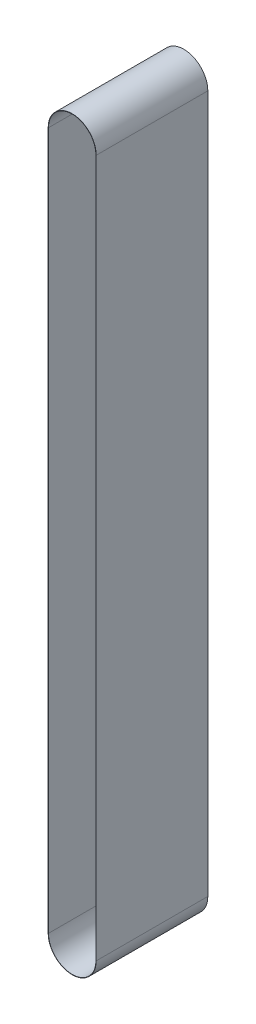
ISO-10303-21;
HEADER;
FILE_DESCRIPTION(('STEP AP214'),'2;1');
FILE_NAME('part.step','',(''),(''),'','','');
FILE_SCHEMA(('AUTOMOTIVE_DESIGN { 1 0 10303 214 1 1 1 1 }'));
ENDSEC;
DATA;
#1=APPLICATION_CONTEXT('core data for automotive mechanical design processes');
#2=APPLICATION_PROTOCOL_DEFINITION('international standard','automotive_design',2000,#1);
#3=PRODUCT_CONTEXT('',#1,'mechanical');
#4=PRODUCT('Part','Part','',(#3));
#5=PRODUCT_RELATED_PRODUCT_CATEGORY('part','',(#4));
#6=PRODUCT_DEFINITION_FORMATION('','',#4);
#7=PRODUCT_DEFINITION_CONTEXT('part definition',#1,'design');
#8=PRODUCT_DEFINITION('design','',#6,#7);
#9=PRODUCT_DEFINITION_SHAPE('','',#8);
#10=(LENGTH_UNIT() NAMED_UNIT(*) SI_UNIT(.MILLI.,.METRE.));
#11=(NAMED_UNIT(*) PLANE_ANGLE_UNIT() SI_UNIT($,.RADIAN.));
#12=(NAMED_UNIT(*) SI_UNIT($,.STERADIAN.) SOLID_ANGLE_UNIT());
#13=UNCERTAINTY_MEASURE_WITH_UNIT(LENGTH_MEASURE(1.E-05),#10,'distance_accuracy_value','');
#14=(GEOMETRIC_REPRESENTATION_CONTEXT(3) GLOBAL_UNCERTAINTY_ASSIGNED_CONTEXT((#13)) GLOBAL_UNIT_ASSIGNED_CONTEXT((#10,
#11,#12)) REPRESENTATION_CONTEXT('',''));
#15=CARTESIAN_POINT('',(0.,0.,0.));
#16=DIRECTION('',(0.,0.,1.));
#17=DIRECTION('',(1.,0.,0.));
#18=AXIS2_PLACEMENT_3D('',#15,#16,#17);
#19=CARTESIAN_POINT('',(0.,-250.,40.));
#20=DIRECTION('',(0.,0.,1.));
#21=DIRECTION('',(1.,0.,0.));
#22=AXIS2_PLACEMENT_3D('',#19,#20,#21);
#23=PLANE('',#22);
#24=CARTESIAN_POINT('',(0.,-250.,40.));
#25=DIRECTION('',(0.,0.,1.));
#26=DIRECTION('',(1.,0.,0.));
#27=AXIS2_PLACEMENT_3D('',#24,#25,#26);
#28=CIRCLE('',#27,17.2);
#29=CARTESIAN_POINT('',(-17.2,-250.,40.));
#30=VERTEX_POINT('',#29);
#31=CARTESIAN_POINT('',(17.2,-250.,40.));
#32=VERTEX_POINT('',#31);
#33=EDGE_CURVE('E175',#30,#32,#28,.T.);
#34=ORIENTED_EDGE('',*,*,#33,.T.);
#35=DIRECTION('',(0.,1.,0.));
#36=VECTOR('',#35,1.);
#37=CARTESIAN_POINT('',(17.2,250.,40.));
#38=LINE('',#37,#36);
#39=CARTESIAN_POINT('',(17.2,250.,40.));
#40=VERTEX_POINT('',#39);
#41=EDGE_CURVE('E178',#32,#40,#38,.T.);
#42=ORIENTED_EDGE('',*,*,#41,.T.);
#43=CARTESIAN_POINT('',(0.,250.,40.));
#44=DIRECTION('',(0.,0.,1.));
#45=DIRECTION('',(-1.,0.,0.));
#46=AXIS2_PLACEMENT_3D('',#43,#44,#45);
#47=CIRCLE('',#46,17.2);
#48=CARTESIAN_POINT('',(-17.2,250.,40.));
#49=VERTEX_POINT('',#48);
#50=EDGE_CURVE('E181',#40,#49,#47,.T.);
#51=ORIENTED_EDGE('',*,*,#50,.T.);
#52=DIRECTION('',(0.,-1.,0.));
#53=VECTOR('',#52,1.);
#54=CARTESIAN_POINT('',(-17.2,-250.,40.));
#55=LINE('',#54,#53);
#56=EDGE_CURVE('E183',#49,#30,#55,.T.);
#57=ORIENTED_EDGE('',*,*,#56,.T.);
#58=EDGE_LOOP('',(#34,#42,#51,#57));
#59=FACE_BOUND('',#58,.T.);
#60=DIRECTION('',(0.,-1.,0.));
#61=VECTOR('',#60,1.);
#62=CARTESIAN_POINT('',(-17.,-250.,40.));
#63=LINE('',#62,#61);
#64=CARTESIAN_POINT('',(-17.,250.,40.));
#65=VERTEX_POINT('',#64);
#66=CARTESIAN_POINT('',(-17.,-250.,40.));
#67=VERTEX_POINT('',#66);
#68=EDGE_CURVE('E146',#65,#67,#63,.T.);
#69=ORIENTED_EDGE('',*,*,#68,.F.);
#70=CARTESIAN_POINT('',(0.,250.,40.));
#71=DIRECTION('',(0.,0.,1.));
#72=DIRECTION('',(-1.,0.,0.));
#73=AXIS2_PLACEMENT_3D('',#70,#71,#72);
#74=CIRCLE('',#73,17.);
#75=CARTESIAN_POINT('',(17.,250.,40.));
#76=VERTEX_POINT('',#75);
#77=EDGE_CURVE('E144',#76,#65,#74,.T.);
#78=ORIENTED_EDGE('',*,*,#77,.F.);
#79=DIRECTION('',(0.,1.,0.));
#80=VECTOR('',#79,1.);
#81=CARTESIAN_POINT('',(17.,250.,40.));
#82=LINE('',#81,#80);
#83=CARTESIAN_POINT('',(17.,-250.,40.));
#84=VERTEX_POINT('',#83);
#85=EDGE_CURVE('E152',#84,#76,#82,.T.);
#86=ORIENTED_EDGE('',*,*,#85,.F.);
#87=CARTESIAN_POINT('',(0.,-250.,40.));
#88=DIRECTION('',(0.,0.,1.));
#89=DIRECTION('',(1.,0.,0.));
#90=AXIS2_PLACEMENT_3D('',#87,#88,#89);
#91=CIRCLE('',#90,17.);
#92=EDGE_CURVE('E149',#67,#84,#91,.T.);
#93=ORIENTED_EDGE('',*,*,#92,.F.);
#94=EDGE_LOOP('',(#69,#78,#86,#93));
#95=FACE_BOUND('',#94,.T.);
#96=ADVANCED_FACE('F33',(#59,#95),#23,.T.);
#97=CARTESIAN_POINT('',(0.,-250.,-40.));
#98=DIRECTION('',(0.,0.,1.));
#99=DIRECTION('',(1.,0.,0.));
#100=AXIS2_PLACEMENT_3D('',#97,#98,#99);
#101=PLANE('',#100);
#102=CARTESIAN_POINT('',(0.,-250.,-40.));
#103=DIRECTION('',(0.,0.,1.));
#104=DIRECTION('',(1.,0.,0.));
#105=AXIS2_PLACEMENT_3D('',#102,#103,#104);
#106=CIRCLE('',#105,17.2);
#107=CARTESIAN_POINT('',(-17.2,-250.,-40.));
#108=VERTEX_POINT('',#107);
#109=CARTESIAN_POINT('',(17.2,-250.,-40.));
#110=VERTEX_POINT('',#109);
#111=EDGE_CURVE('E174',#108,#110,#106,.T.);
#112=ORIENTED_EDGE('',*,*,#111,.F.);
#113=DIRECTION('',(0.,-1.,0.));
#114=VECTOR('',#113,1.);
#115=CARTESIAN_POINT('',(-17.2,-250.,-40.));
#116=LINE('',#115,#114);
#117=CARTESIAN_POINT('',(-17.2,250.,-40.));
#118=VERTEX_POINT('',#117);
#119=EDGE_CURVE('E179',#118,#108,#116,.T.);
#120=ORIENTED_EDGE('',*,*,#119,.F.);
#121=CARTESIAN_POINT('',(0.,250.,-40.));
#122=DIRECTION('',(0.,0.,1.));
#123=DIRECTION('',(-1.,0.,0.));
#124=AXIS2_PLACEMENT_3D('',#121,#122,#123);
#125=CIRCLE('',#124,17.2);
#126=CARTESIAN_POINT('',(17.2,250.,-40.));
#127=VERTEX_POINT('',#126);
#128=EDGE_CURVE('E190',#127,#118,#125,.T.);
#129=ORIENTED_EDGE('',*,*,#128,.F.);
#130=DIRECTION('',(0.,1.,0.));
#131=VECTOR('',#130,1.);
#132=CARTESIAN_POINT('',(17.2,250.,-40.));
#133=LINE('',#132,#131);
#134=EDGE_CURVE('E188',#110,#127,#133,.T.);
#135=ORIENTED_EDGE('',*,*,#134,.F.);
#136=EDGE_LOOP('',(#112,#120,#129,#135));
#137=FACE_BOUND('',#136,.T.);
#138=CARTESIAN_POINT('',(0.,250.,-40.));
#139=DIRECTION('',(0.,0.,1.));
#140=DIRECTION('',(-1.,0.,0.));
#141=AXIS2_PLACEMENT_3D('',#138,#139,#140);
#142=CIRCLE('',#141,17.);
#143=CARTESIAN_POINT('',(17.,250.,-40.));
#144=VERTEX_POINT('',#143);
#145=CARTESIAN_POINT('',(-17.,250.,-40.));
#146=VERTEX_POINT('',#145);
#147=EDGE_CURVE('E140',#144,#146,#142,.T.);
#148=ORIENTED_EDGE('',*,*,#147,.T.);
#149=DIRECTION('',(0.,-1.,0.));
#150=VECTOR('',#149,1.);
#151=CARTESIAN_POINT('',(-17.,-250.,-40.));
#152=LINE('',#151,#150);
#153=CARTESIAN_POINT('',(-17.,-250.,-40.));
#154=VERTEX_POINT('',#153);
#155=EDGE_CURVE('E157',#146,#154,#152,.T.);
#156=ORIENTED_EDGE('',*,*,#155,.T.);
#157=CARTESIAN_POINT('',(0.,-250.,-40.));
#158=DIRECTION('',(0.,0.,1.));
#159=DIRECTION('',(1.,0.,0.));
#160=AXIS2_PLACEMENT_3D('',#157,#158,#159);
#161=CIRCLE('',#160,17.);
#162=CARTESIAN_POINT('',(17.,-250.,-40.));
#163=VERTEX_POINT('',#162);
#164=EDGE_CURVE('E160',#154,#163,#161,.T.);
#165=ORIENTED_EDGE('',*,*,#164,.T.);
#166=DIRECTION('',(0.,1.,0.));
#167=VECTOR('',#166,1.);
#168=CARTESIAN_POINT('',(17.,250.,-40.));
#169=LINE('',#168,#167);
#170=EDGE_CURVE('E147',#163,#144,#169,.T.);
#171=ORIENTED_EDGE('',*,*,#170,.T.);
#172=EDGE_LOOP('',(#148,#156,#165,#171));
#173=FACE_BOUND('',#172,.T.);
#174=ADVANCED_FACE('F229',(#137,#173),#101,.F.);
#175=CARTESIAN_POINT('',(0.,-250.,40.));
#176=DIRECTION('',(0.,0.,-1.));
#177=DIRECTION('',(-1.,0.,0.));
#178=AXIS2_PLACEMENT_3D('',#175,#176,#177);
#179=CYLINDRICAL_SURFACE('',#178,17.2);
#180=DIRECTION('',(0.,0.,-1.));
#181=VECTOR('',#180,1.);
#182=CARTESIAN_POINT('',(5.,-266.457217261737,40.));
#183=LINE('',#182,#181);
#184=CARTESIAN_POINT('',(5.,-266.457217261737,-5.));
#185=VERTEX_POINT('',#184);
#186=CARTESIAN_POINT('',(5.,-266.457217261737,5.));
#187=VERTEX_POINT('',#186);
#188=EDGE_CURVE('E138',#185,#187,#183,.F.);
#189=ORIENTED_EDGE('',*,*,#188,.F.);
#190=CARTESIAN_POINT('',(0.,-250.,-5.));
#191=DIRECTION('',(0.,0.,-1.));
#192=DIRECTION('',(-1.,0.,0.));
#193=AXIS2_PLACEMENT_3D('',#190,#191,#192);
#194=CIRCLE('',#193,17.2);
#195=CARTESIAN_POINT('',(-5.,-266.457217261737,-5.));
#196=VERTEX_POINT('',#195);
#197=EDGE_CURVE('E123',#185,#196,#194,.T.);
#198=ORIENTED_EDGE('',*,*,#197,.T.);
#199=DIRECTION('',(0.,0.,-1.));
#200=VECTOR('',#199,1.);
#201=CARTESIAN_POINT('',(-5.,-266.457217261737,40.));
#202=LINE('',#201,#200);
#203=CARTESIAN_POINT('',(-5.,-266.457217261737,5.));
#204=VERTEX_POINT('',#203);
#205=EDGE_CURVE('E129',#196,#204,#202,.F.);
#206=ORIENTED_EDGE('',*,*,#205,.T.);
#207=CARTESIAN_POINT('',(0.,-250.,5.));
#208=DIRECTION('',(0.,0.,-1.));
#209=DIRECTION('',(-1.,0.,0.));
#210=AXIS2_PLACEMENT_3D('',#207,#208,#209);
#211=CIRCLE('',#210,17.2);
#212=EDGE_CURVE('E118',#187,#204,#211,.T.);
#213=ORIENTED_EDGE('',*,*,#212,.F.);
#214=EDGE_LOOP('',(#189,#198,#206,#213));
#215=FACE_BOUND('',#214,.T.);
#216=ORIENTED_EDGE('',*,*,#111,.T.);
#217=DIRECTION('',(0.,0.,-1.));
#218=VECTOR('',#217,1.);
#219=CARTESIAN_POINT('',(17.2,-250.,40.));
#220=LINE('',#219,#218);
#221=EDGE_CURVE('E201',#32,#110,#220,.T.);
#222=ORIENTED_EDGE('',*,*,#221,.F.);
#223=ORIENTED_EDGE('',*,*,#33,.F.);
#224=DIRECTION('',(0.,0.,-1.));
#225=VECTOR('',#224,1.);
#226=CARTESIAN_POINT('',(-17.2,-250.,40.));
#227=LINE('',#226,#225);
#228=EDGE_CURVE('E185',#30,#108,#227,.T.);
#229=ORIENTED_EDGE('',*,*,#228,.T.);
#230=EDGE_LOOP('',(#216,#222,#223,#229));
#231=FACE_BOUND('',#230,.T.);
#232=ADVANCED_FACE('F35',(#215,#231),#179,.T.);
#233=CARTESIAN_POINT('',(17.2,250.,40.));
#234=DIRECTION('',(-1.,0.,0.));
#235=DIRECTION('',(0.,0.,1.));
#236=AXIS2_PLACEMENT_3D('',#233,#234,#235);
#237=PLANE('',#236);
#238=ORIENTED_EDGE('',*,*,#134,.T.);
#239=DIRECTION('',(0.,0.,-1.));
#240=VECTOR('',#239,1.);
#241=CARTESIAN_POINT('',(17.2,250.,40.));
#242=LINE('',#241,#240);
#243=EDGE_CURVE('E198',#40,#127,#242,.T.);
#244=ORIENTED_EDGE('',*,*,#243,.F.);
#245=ORIENTED_EDGE('',*,*,#41,.F.);
#246=ORIENTED_EDGE('',*,*,#221,.T.);
#247=EDGE_LOOP('',(#238,#244,#245,#246));
#248=FACE_BOUND('',#247,.T.);
#249=ADVANCED_FACE('F248',(#248),#237,.F.);
#250=CARTESIAN_POINT('',(0.,250.,40.));
#251=DIRECTION('',(0.,0.,-1.));
#252=DIRECTION('',(-1.,0.,0.));
#253=AXIS2_PLACEMENT_3D('',#250,#251,#252);
#254=CYLINDRICAL_SURFACE('',#253,17.2);
#255=ORIENTED_EDGE('',*,*,#128,.T.);
#256=DIRECTION('',(0.,0.,-1.));
#257=VECTOR('',#256,1.);
#258=CARTESIAN_POINT('',(-17.2,250.,40.));
#259=LINE('',#258,#257);
#260=EDGE_CURVE('E195',#49,#118,#259,.T.);
#261=ORIENTED_EDGE('',*,*,#260,.F.);
#262=ORIENTED_EDGE('',*,*,#50,.F.);
#263=ORIENTED_EDGE('',*,*,#243,.T.);
#264=EDGE_LOOP('',(#255,#261,#262,#263));
#265=FACE_BOUND('',#264,.T.);
#266=ADVANCED_FACE('F245',(#265),#254,.T.);
#267=CARTESIAN_POINT('',(-17.2,-250.,40.));
#268=DIRECTION('',(1.,0.,0.));
#269=DIRECTION('',(0.,0.,-1.));
#270=AXIS2_PLACEMENT_3D('',#267,#268,#269);
#271=PLANE('',#270);
#272=ORIENTED_EDGE('',*,*,#119,.T.);
#273=ORIENTED_EDGE('',*,*,#228,.F.);
#274=ORIENTED_EDGE('',*,*,#56,.F.);
#275=ORIENTED_EDGE('',*,*,#260,.T.);
#276=EDGE_LOOP('',(#272,#273,#274,#275));
#277=FACE_BOUND('',#276,.T.);
#278=ADVANCED_FACE('F242',(#277),#271,.F.);
#279=CARTESIAN_POINT('',(0.,250.,40.));
#280=DIRECTION('',(0.,0.,-1.));
#281=DIRECTION('',(-1.,0.,0.));
#282=AXIS2_PLACEMENT_3D('',#279,#280,#281);
#283=CYLINDRICAL_SURFACE('',#282,17.);
#284=ORIENTED_EDGE('',*,*,#147,.F.);
#285=DIRECTION('',(0.,0.,-1.));
#286=VECTOR('',#285,1.);
#287=CARTESIAN_POINT('',(17.,250.,40.));
#288=LINE('',#287,#286);
#289=EDGE_CURVE('E154',#76,#144,#288,.T.);
#290=ORIENTED_EDGE('',*,*,#289,.F.);
#291=ORIENTED_EDGE('',*,*,#77,.T.);
#292=DIRECTION('',(0.,0.,-1.));
#293=VECTOR('',#292,1.);
#294=CARTESIAN_POINT('',(-17.,250.,40.));
#295=LINE('',#294,#293);
#296=EDGE_CURVE('E171',#65,#146,#295,.T.);
#297=ORIENTED_EDGE('',*,*,#296,.T.);
#298=EDGE_LOOP('',(#284,#290,#291,#297));
#299=FACE_BOUND('',#298,.T.);
#300=ADVANCED_FACE('F239',(#299),#283,.F.);
#301=CARTESIAN_POINT('',(-17.,-250.,40.));
#302=DIRECTION('',(1.,0.,0.));
#303=DIRECTION('',(0.,0.,-1.));
#304=AXIS2_PLACEMENT_3D('',#301,#302,#303);
#305=PLANE('',#304);
#306=ORIENTED_EDGE('',*,*,#155,.F.);
#307=ORIENTED_EDGE('',*,*,#296,.F.);
#308=ORIENTED_EDGE('',*,*,#68,.T.);
#309=DIRECTION('',(0.,0.,-1.));
#310=VECTOR('',#309,1.);
#311=CARTESIAN_POINT('',(-17.,-250.,40.));
#312=LINE('',#311,#310);
#313=EDGE_CURVE('E169',#67,#154,#312,.T.);
#314=ORIENTED_EDGE('',*,*,#313,.T.);
#315=EDGE_LOOP('',(#306,#307,#308,#314));
#316=FACE_BOUND('',#315,.T.);
#317=ADVANCED_FACE('F277',(#316),#305,.T.);
#318=CARTESIAN_POINT('',(0.,-250.,40.));
#319=DIRECTION('',(0.,0.,-1.));
#320=DIRECTION('',(-1.,0.,0.));
#321=AXIS2_PLACEMENT_3D('',#318,#319,#320);
#322=CYLINDRICAL_SURFACE('',#321,17.);
#323=CARTESIAN_POINT('',(0.,-250.,-5.));
#324=DIRECTION('',(0.,0.,-1.));
#325=DIRECTION('',(-1.,0.,0.));
#326=AXIS2_PLACEMENT_3D('',#323,#324,#325);
#327=CIRCLE('',#326,17.);
#328=CARTESIAN_POINT('',(5.,-266.248076809272,-5.));
#329=VERTEX_POINT('',#328);
#330=CARTESIAN_POINT('',(-5.,-266.248076809272,-5.));
#331=VERTEX_POINT('',#330);
#332=EDGE_CURVE('E11',#329,#331,#327,.T.);
#333=ORIENTED_EDGE('',*,*,#332,.F.);
#334=DIRECTION('',(0.,0.,-1.));
#335=VECTOR('',#334,1.);
#336=CARTESIAN_POINT('',(5.,-266.248076809272,40.));
#337=LINE('',#336,#335);
#338=CARTESIAN_POINT('',(5.,-266.248076809272,5.));
#339=VERTEX_POINT('',#338);
#340=EDGE_CURVE('E41',#329,#339,#337,.F.);
#341=ORIENTED_EDGE('',*,*,#340,.T.);
#342=CARTESIAN_POINT('',(0.,-250.,5.));
#343=DIRECTION('',(0.,0.,-1.));
#344=DIRECTION('',(-1.,0.,0.));
#345=AXIS2_PLACEMENT_3D('',#342,#343,#344);
#346=CIRCLE('',#345,17.);
#347=CARTESIAN_POINT('',(-5.,-266.248076809272,5.));
#348=VERTEX_POINT('',#347);
#349=EDGE_CURVE('E204',#339,#348,#346,.T.);
#350=ORIENTED_EDGE('',*,*,#349,.T.);
#351=DIRECTION('',(0.,0.,-1.));
#352=VECTOR('',#351,1.);
#353=CARTESIAN_POINT('',(-5.,-266.248076809272,40.));
#354=LINE('',#353,#352);
#355=EDGE_CURVE('E132',#331,#348,#354,.F.);
#356=ORIENTED_EDGE('',*,*,#355,.F.);
#357=EDGE_LOOP('',(#333,#341,#350,#356));
#358=FACE_BOUND('',#357,.T.);
#359=ORIENTED_EDGE('',*,*,#164,.F.);
#360=ORIENTED_EDGE('',*,*,#313,.F.);
#361=ORIENTED_EDGE('',*,*,#92,.T.);
#362=DIRECTION('',(0.,0.,-1.));
#363=VECTOR('',#362,1.);
#364=CARTESIAN_POINT('',(17.,-250.,40.));
#365=LINE('',#364,#363);
#366=EDGE_CURVE('E167',#84,#163,#365,.T.);
#367=ORIENTED_EDGE('',*,*,#366,.T.);
#368=EDGE_LOOP('',(#359,#360,#361,#367));
#369=FACE_BOUND('',#368,.T.);
#370=ADVANCED_FACE('F209',(#358,#369),#322,.F.);
#371=CARTESIAN_POINT('',(17.,250.,40.));
#372=DIRECTION('',(-1.,0.,0.));
#373=DIRECTION('',(0.,0.,1.));
#374=AXIS2_PLACEMENT_3D('',#371,#372,#373);
#375=PLANE('',#374);
#376=ORIENTED_EDGE('',*,*,#170,.F.);
#377=ORIENTED_EDGE('',*,*,#366,.F.);
#378=ORIENTED_EDGE('',*,*,#85,.T.);
#379=ORIENTED_EDGE('',*,*,#289,.T.);
#380=EDGE_LOOP('',(#376,#377,#378,#379));
#381=FACE_BOUND('',#380,.T.);
#382=ADVANCED_FACE('F272',(#381),#375,.T.);
#383=CARTESIAN_POINT('',(5.,-262.,-5.));
#384=DIRECTION('',(-1.,0.,0.));
#385=DIRECTION('',(0.,-1.,0.));
#386=AXIS2_PLACEMENT_3D('',#383,#384,#385);
#387=PLANE('',#386);
#388=ORIENTED_EDGE('',*,*,#188,.T.);
#389=DIRECTION('',(0.,-1.,0.));
#390=VECTOR('',#389,1.);
#391=CARTESIAN_POINT('',(5.,-262.,5.));
#392=LINE('',#391,#390);
#393=EDGE_CURVE('E48',#339,#187,#392,.T.);
#394=ORIENTED_EDGE('',*,*,#393,.F.);
#395=ORIENTED_EDGE('',*,*,#340,.F.);
#396=DIRECTION('',(0.,-1.,0.));
#397=VECTOR('',#396,1.);
#398=CARTESIAN_POINT('',(5.,-262.,-5.));
#399=LINE('',#398,#397);
#400=EDGE_CURVE('E134',#329,#185,#399,.T.);
#401=ORIENTED_EDGE('',*,*,#400,.T.);
#402=EDGE_LOOP('',(#388,#394,#395,#401));
#403=FACE_BOUND('',#402,.T.);
#404=ADVANCED_FACE('F214',(#403),#387,.T.);
#405=CARTESIAN_POINT('',(-5.,-262.,-5.));
#406=DIRECTION('',(-1.,0.,0.));
#407=DIRECTION('',(0.,-1.,0.));
#408=AXIS2_PLACEMENT_3D('',#405,#406,#407);
#409=PLANE('',#408);
#410=DIRECTION('',(0.,-1.,0.));
#411=VECTOR('',#410,1.);
#412=CARTESIAN_POINT('',(-5.,-262.,-5.));
#413=LINE('',#412,#411);
#414=EDGE_CURVE('E124',#331,#196,#413,.T.);
#415=ORIENTED_EDGE('',*,*,#414,.F.);
#416=ORIENTED_EDGE('',*,*,#355,.T.);
#417=DIRECTION('',(0.,-1.,0.));
#418=VECTOR('',#417,1.);
#419=CARTESIAN_POINT('',(-5.,-262.,5.));
#420=LINE('',#419,#418);
#421=EDGE_CURVE('E53',#348,#204,#420,.T.);
#422=ORIENTED_EDGE('',*,*,#421,.T.);
#423=ORIENTED_EDGE('',*,*,#205,.F.);
#424=EDGE_LOOP('',(#415,#416,#422,#423));
#425=FACE_BOUND('',#424,.T.);
#426=ADVANCED_FACE('F128',(#425),#409,.F.);
#427=CARTESIAN_POINT('',(0.,0.,-5.));
#428=DIRECTION('',(0.,0.,-1.));
#429=DIRECTION('',(-1.,0.,0.));
#430=AXIS2_PLACEMENT_3D('',#427,#428,#429);
#431=PLANE('',#430);
#432=ORIENTED_EDGE('',*,*,#400,.F.);
#433=ORIENTED_EDGE('',*,*,#332,.T.);
#434=ORIENTED_EDGE('',*,*,#414,.T.);
#435=ORIENTED_EDGE('',*,*,#197,.F.);
#436=EDGE_LOOP('',(#432,#433,#434,#435));
#437=FACE_BOUND('',#436,.T.);
#438=ADVANCED_FACE('F216',(#437),#431,.F.);
#439=CARTESIAN_POINT('',(0.,0.,5.));
#440=DIRECTION('',(0.,0.,-1.));
#441=DIRECTION('',(-1.,0.,0.));
#442=AXIS2_PLACEMENT_3D('',#439,#440,#441);
#443=PLANE('',#442);
#444=ORIENTED_EDGE('',*,*,#212,.T.);
#445=ORIENTED_EDGE('',*,*,#421,.F.);
#446=ORIENTED_EDGE('',*,*,#349,.F.);
#447=ORIENTED_EDGE('',*,*,#393,.T.);
#448=EDGE_LOOP('',(#444,#445,#446,#447));
#449=FACE_BOUND('',#448,.T.);
#450=ADVANCED_FACE('F119',(#449),#443,.T.);
#451=CLOSED_SHELL('',(#96,#174,#232,#249,#266,#278,#300,#317,#370,#382,#404,#426,#438,#450));
#452=MANIFOLD_SOLID_BREP('B2',#451);
#453=ADVANCED_BREP_SHAPE_REPRESENTATION('',(#18,#452),#14);
#454=SHAPE_DEFINITION_REPRESENTATION(#9,#453);
ENDSEC;
END-ISO-10303-21;
